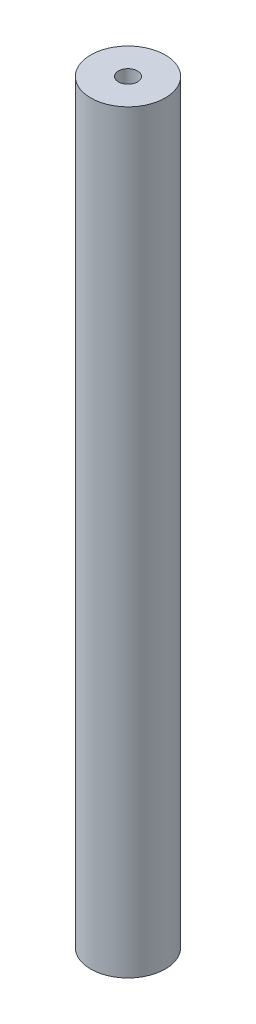
ISO-10303-21;
HEADER;
FILE_DESCRIPTION(('STEP AP214'),'2;1');
FILE_NAME('part.step','',(''),(''),'','','');
FILE_SCHEMA(('AUTOMOTIVE_DESIGN { 1 0 10303 214 1 1 1 1 }'));
ENDSEC;
DATA;
#1=APPLICATION_CONTEXT('core data for automotive mechanical design processes');
#2=APPLICATION_PROTOCOL_DEFINITION('international standard','automotive_design',2000,#1);
#3=PRODUCT_CONTEXT('',#1,'mechanical');
#4=PRODUCT('Part','Part','',(#3));
#5=PRODUCT_RELATED_PRODUCT_CATEGORY('part','',(#4));
#6=PRODUCT_DEFINITION_FORMATION('','',#4);
#7=PRODUCT_DEFINITION_CONTEXT('part definition',#1,'design');
#8=PRODUCT_DEFINITION('design','',#6,#7);
#9=PRODUCT_DEFINITION_SHAPE('','',#8);
#10=(LENGTH_UNIT() NAMED_UNIT(*) SI_UNIT(.MILLI.,.METRE.));
#11=(NAMED_UNIT(*) PLANE_ANGLE_UNIT() SI_UNIT($,.RADIAN.));
#12=(NAMED_UNIT(*) SI_UNIT($,.STERADIAN.) SOLID_ANGLE_UNIT());
#13=UNCERTAINTY_MEASURE_WITH_UNIT(LENGTH_MEASURE(1.E-05),#10,'distance_accuracy_value','');
#14=(GEOMETRIC_REPRESENTATION_CONTEXT(3) GLOBAL_UNCERTAINTY_ASSIGNED_CONTEXT((#13)) GLOBAL_UNIT_ASSIGNED_CONTEXT((#10,
#11,#12)) REPRESENTATION_CONTEXT('',''));
#15=CARTESIAN_POINT('',(0.,0.,0.));
#16=DIRECTION('',(0.,0.,1.));
#17=DIRECTION('',(1.,0.,0.));
#18=AXIS2_PLACEMENT_3D('',#15,#16,#17);
#19=CARTESIAN_POINT('',(0.,166.,0.));
#20=DIRECTION('',(0.,-1.,0.));
#21=DIRECTION('',(0.,0.,-1.));
#22=AXIS2_PLACEMENT_3D('',#19,#20,#21);
#23=CYLINDRICAL_SURFACE('',#22,8.2);
#24=CARTESIAN_POINT('',(0.,166.,0.));
#25=DIRECTION('',(0.,1.,0.));
#26=DIRECTION('',(0.,0.,1.));
#27=AXIS2_PLACEMENT_3D('',#24,#25,#26);
#28=CIRCLE('',#27,8.2);
#29=CARTESIAN_POINT('',(0.,166.,8.2));
#30=VERTEX_POINT('',#29);
#31=EDGE_CURVE('E10',#30,#30,#28,.T.);
#32=ORIENTED_EDGE('',*,*,#31,.F.);
#33=EDGE_LOOP('',(#32));
#34=FACE_BOUND('',#33,.T.);
#35=CARTESIAN_POINT('',(0.,0.,0.));
#36=DIRECTION('',(0.,1.,0.));
#37=DIRECTION('',(0.,0.,1.));
#38=AXIS2_PLACEMENT_3D('',#35,#36,#37);
#39=CIRCLE('',#38,8.2);
#40=CARTESIAN_POINT('',(0.,0.,8.2));
#41=VERTEX_POINT('',#40);
#42=EDGE_CURVE('E34',#41,#41,#39,.T.);
#43=ORIENTED_EDGE('',*,*,#42,.T.);
#44=EDGE_LOOP('',(#43));
#45=FACE_BOUND('',#44,.T.);
#46=ADVANCED_FACE('F31',(#34,#45),#23,.T.);
#47=CARTESIAN_POINT('',(0.,166.,0.));
#48=DIRECTION('',(0.,1.,0.));
#49=DIRECTION('',(0.,0.,1.));
#50=AXIS2_PLACEMENT_3D('',#47,#48,#49);
#51=PLANE('',#50);
#52=CARTESIAN_POINT('',(0.,166.,0.));
#53=DIRECTION('',(0.,1.,0.));
#54=DIRECTION('',(0.,0.,1.));
#55=AXIS2_PLACEMENT_3D('',#52,#53,#54);
#56=CIRCLE('',#55,2.1);
#57=CARTESIAN_POINT('',(0.,166.,2.1));
#58=VERTEX_POINT('',#57);
#59=EDGE_CURVE('E43',#58,#58,#56,.T.);
#60=ORIENTED_EDGE('',*,*,#59,.F.);
#61=EDGE_LOOP('',(#60));
#62=FACE_BOUND('',#61,.T.);
#63=ORIENTED_EDGE('',*,*,#31,.T.);
#64=EDGE_LOOP('',(#63));
#65=FACE_BOUND('',#64,.T.);
#66=ADVANCED_FACE('F68',(#62,#65),#51,.T.);
#67=CARTESIAN_POINT('',(0.,0.,0.));
#68=DIRECTION('',(0.,1.,0.));
#69=DIRECTION('',(0.,0.,1.));
#70=AXIS2_PLACEMENT_3D('',#67,#68,#69);
#71=PLANE('',#70);
#72=CARTESIAN_POINT('',(0.,0.,0.));
#73=DIRECTION('',(0.,-1.,0.));
#74=DIRECTION('',(0.,0.,-1.));
#75=AXIS2_PLACEMENT_3D('',#72,#73,#74);
#76=CIRCLE('',#75,2.1);
#77=CARTESIAN_POINT('',(0.,0.,-2.1));
#78=VERTEX_POINT('',#77);
#79=EDGE_CURVE('E49',#78,#78,#76,.T.);
#80=ORIENTED_EDGE('',*,*,#79,.F.);
#81=EDGE_LOOP('',(#80));
#82=FACE_BOUND('',#81,.T.);
#83=ORIENTED_EDGE('',*,*,#42,.F.);
#84=EDGE_LOOP('',(#83));
#85=FACE_BOUND('',#84,.T.);
#86=ADVANCED_FACE('F64',(#82,#85),#71,.F.);
#87=CARTESIAN_POINT('',(0.,156.,0.));
#88=DIRECTION('',(0.,1.,0.));
#89=DIRECTION('',(0.,0.,1.));
#90=AXIS2_PLACEMENT_3D('',#87,#88,#89);
#91=CYLINDRICAL_SURFACE('',#90,2.1);
#92=CARTESIAN_POINT('',(0.,156.,0.));
#93=DIRECTION('',(0.,1.,0.));
#94=DIRECTION('',(0.,0.,1.));
#95=AXIS2_PLACEMENT_3D('',#92,#93,#94);
#96=CIRCLE('',#95,2.1);
#97=CARTESIAN_POINT('',(0.,156.,2.1));
#98=VERTEX_POINT('',#97);
#99=EDGE_CURVE('E41',#98,#98,#96,.T.);
#100=ORIENTED_EDGE('',*,*,#99,.F.);
#101=EDGE_LOOP('',(#100));
#102=FACE_BOUND('',#101,.T.);
#103=ORIENTED_EDGE('',*,*,#59,.T.);
#104=EDGE_LOOP('',(#103));
#105=FACE_BOUND('',#104,.T.);
#106=ADVANCED_FACE('F67',(#102,#105),#91,.F.);
#107=CARTESIAN_POINT('',(0.,156.,0.));
#108=DIRECTION('',(0.,1.,0.));
#109=DIRECTION('',(0.,0.,1.));
#110=AXIS2_PLACEMENT_3D('',#107,#108,#109);
#111=PLANE('',#110);
#112=ORIENTED_EDGE('',*,*,#99,.T.);
#113=EDGE_LOOP('',(#112));
#114=FACE_BOUND('',#113,.T.);
#115=ADVANCED_FACE('F60',(#114),#111,.T.);
#116=CARTESIAN_POINT('',(0.,10.,0.));
#117=DIRECTION('',(0.,-1.,0.));
#118=DIRECTION('',(0.,0.,-1.));
#119=AXIS2_PLACEMENT_3D('',#116,#117,#118);
#120=CYLINDRICAL_SURFACE('',#119,2.1);
#121=CARTESIAN_POINT('',(0.,10.,0.));
#122=DIRECTION('',(0.,-1.,0.));
#123=DIRECTION('',(0.,0.,-1.));
#124=AXIS2_PLACEMENT_3D('',#121,#122,#123);
#125=CIRCLE('',#124,2.1);
#126=CARTESIAN_POINT('',(0.,10.,-2.1));
#127=VERTEX_POINT('',#126);
#128=EDGE_CURVE('E46',#127,#127,#125,.T.);
#129=ORIENTED_EDGE('',*,*,#128,.F.);
#130=EDGE_LOOP('',(#129));
#131=FACE_BOUND('',#130,.T.);
#132=ORIENTED_EDGE('',*,*,#79,.T.);
#133=EDGE_LOOP('',(#132));
#134=FACE_BOUND('',#133,.T.);
#135=ADVANCED_FACE('F57',(#131,#134),#120,.F.);
#136=CARTESIAN_POINT('',(0.,10.,0.));
#137=DIRECTION('',(0.,-1.,0.));
#138=DIRECTION('',(0.,0.,-1.));
#139=AXIS2_PLACEMENT_3D('',#136,#137,#138);
#140=PLANE('',#139);
#141=ORIENTED_EDGE('',*,*,#128,.T.);
#142=EDGE_LOOP('',(#141));
#143=FACE_BOUND('',#142,.T.);
#144=ADVANCED_FACE('F55',(#143),#140,.T.);
#145=CLOSED_SHELL('',(#46,#66,#86,#106,#115,#135,#144));
#146=MANIFOLD_SOLID_BREP('B2',#145);
#147=ADVANCED_BREP_SHAPE_REPRESENTATION('',(#18,#146),#14);
#148=SHAPE_DEFINITION_REPRESENTATION(#9,#147);
ENDSEC;
END-ISO-10303-21;
